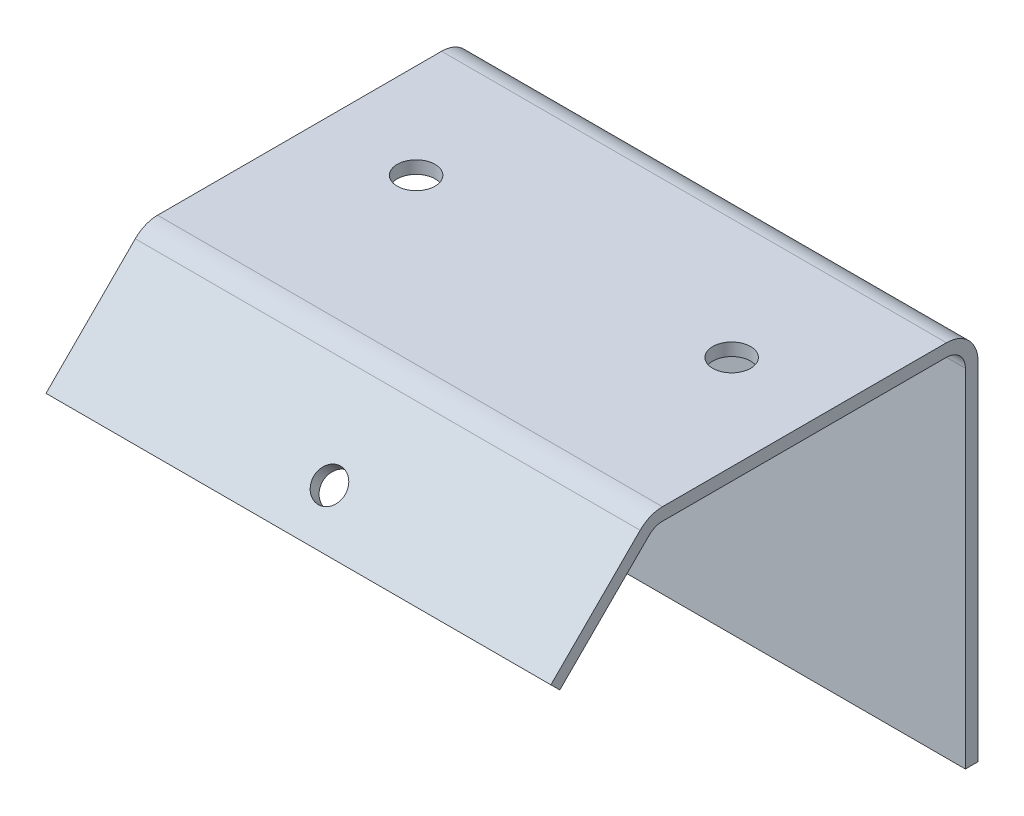
ISO-10303-21;
HEADER;
FILE_DESCRIPTION(('STEP AP214'),'2;1');
FILE_NAME('part.step','',(''),(''),'','','');
FILE_SCHEMA(('AUTOMOTIVE_DESIGN { 1 0 10303 214 1 1 1 1 }'));
ENDSEC;
DATA;
#1=APPLICATION_CONTEXT('core data for automotive mechanical design processes');
#2=APPLICATION_PROTOCOL_DEFINITION('international standard','automotive_design',2000,#1);
#3=PRODUCT_CONTEXT('',#1,'mechanical');
#4=PRODUCT('Part','Part','',(#3));
#5=PRODUCT_RELATED_PRODUCT_CATEGORY('part','',(#4));
#6=PRODUCT_DEFINITION_FORMATION('','',#4);
#7=PRODUCT_DEFINITION_CONTEXT('part definition',#1,'design');
#8=PRODUCT_DEFINITION('design','',#6,#7);
#9=PRODUCT_DEFINITION_SHAPE('','',#8);
#10=(LENGTH_UNIT() NAMED_UNIT(*) SI_UNIT(.MILLI.,.METRE.));
#11=(NAMED_UNIT(*) PLANE_ANGLE_UNIT() SI_UNIT($,.RADIAN.));
#12=(NAMED_UNIT(*) SI_UNIT($,.STERADIAN.) SOLID_ANGLE_UNIT());
#13=UNCERTAINTY_MEASURE_WITH_UNIT(LENGTH_MEASURE(1.E-05),#10,'distance_accuracy_value','');
#14=(GEOMETRIC_REPRESENTATION_CONTEXT(3) GLOBAL_UNCERTAINTY_ASSIGNED_CONTEXT((#13)) GLOBAL_UNIT_ASSIGNED_CONTEXT((#10,
#11,#12)) REPRESENTATION_CONTEXT('',''));
#15=CARTESIAN_POINT('',(0.,0.,0.));
#16=DIRECTION('',(0.,0.,1.));
#17=DIRECTION('',(1.,0.,0.));
#18=AXIS2_PLACEMENT_3D('',#15,#16,#17);
#19=CARTESIAN_POINT('',(40.,0.,2.));
#20=DIRECTION('',(0.,1.,0.));
#21=DIRECTION('',(0.,0.,1.));
#22=AXIS2_PLACEMENT_3D('',#19,#20,#21);
#23=PLANE('',#22);
#24=DIRECTION('',(0.,0.,-1.));
#25=VECTOR('',#24,1.);
#26=CARTESIAN_POINT('',(-40.,0.,2.));
#27=LINE('',#26,#25);
#28=CARTESIAN_POINT('',(-40.,0.,2.));
#29=VERTEX_POINT('',#28);
#30=CARTESIAN_POINT('',(-40.,0.,0.));
#31=VERTEX_POINT('',#30);
#32=EDGE_CURVE('E199',#29,#31,#27,.T.);
#33=ORIENTED_EDGE('',*,*,#32,.T.);
#34=DIRECTION('',(-1.,0.,0.));
#35=VECTOR('',#34,1.);
#36=CARTESIAN_POINT('',(40.,0.,0.));
#37=LINE('',#36,#35);
#38=CARTESIAN_POINT('',(40.,0.,0.));
#39=VERTEX_POINT('',#38);
#40=EDGE_CURVE('E12',#39,#31,#37,.T.);
#41=ORIENTED_EDGE('',*,*,#40,.F.);
#42=DIRECTION('',(0.,0.,-1.));
#43=VECTOR('',#42,1.);
#44=CARTESIAN_POINT('',(40.,0.,2.));
#45=LINE('',#44,#43);
#46=CARTESIAN_POINT('',(40.,0.,2.));
#47=VERTEX_POINT('',#46);
#48=EDGE_CURVE('E233',#47,#39,#45,.T.);
#49=ORIENTED_EDGE('',*,*,#48,.F.);
#50=DIRECTION('',(-1.,0.,0.));
#51=VECTOR('',#50,1.);
#52=CARTESIAN_POINT('',(40.,0.,2.));
#53=LINE('',#52,#51);
#54=EDGE_CURVE('E195',#47,#29,#53,.T.);
#55=ORIENTED_EDGE('',*,*,#54,.T.);
#56=EDGE_LOOP('',(#33,#41,#49,#55));
#57=FACE_BOUND('',#56,.T.);
#58=ADVANCED_FACE('F69',(#57),#23,.F.);
#59=CARTESIAN_POINT('',(40.,0.,0.));
#60=DIRECTION('',(0.,0.,1.));
#61=DIRECTION('',(1.,0.,0.));
#62=AXIS2_PLACEMENT_3D('',#59,#60,#61);
#63=PLANE('',#62);
#64=CARTESIAN_POINT('',(0.,25.,0.));
#65=DIRECTION('',(0.,0.,1.));
#66=DIRECTION('',(1.,0.,0.));
#67=AXIS2_PLACEMENT_3D('',#64,#65,#66);
#68=CIRCLE('',#67,4.);
#69=CARTESIAN_POINT('',(4.,25.,0.));
#70=VERTEX_POINT('',#69);
#71=EDGE_CURVE('E269',#70,#70,#68,.T.);
#72=ORIENTED_EDGE('',*,*,#71,.T.);
#73=EDGE_LOOP('',(#72));
#74=FACE_BOUND('',#73,.T.);
#75=DIRECTION('',(0.,1.,0.));
#76=VECTOR('',#75,1.);
#77=CARTESIAN_POINT('',(-40.,0.,0.));
#78=LINE('',#77,#76);
#79=CARTESIAN_POINT('',(-40.,55.,0.));
#80=VERTEX_POINT('',#79);
#81=EDGE_CURVE('E203',#31,#80,#78,.T.);
#82=ORIENTED_EDGE('',*,*,#81,.T.);
#83=DIRECTION('',(-1.,0.,0.));
#84=VECTOR('',#83,1.);
#85=CARTESIAN_POINT('',(40.,55.,0.));
#86=LINE('',#85,#84);
#87=CARTESIAN_POINT('',(40.,55.,0.));
#88=VERTEX_POINT('',#87);
#89=EDGE_CURVE('E80',#88,#80,#86,.T.);
#90=ORIENTED_EDGE('',*,*,#89,.F.);
#91=DIRECTION('',(0.,1.,0.));
#92=VECTOR('',#91,1.);
#93=CARTESIAN_POINT('',(40.,0.,0.));
#94=LINE('',#93,#92);
#95=EDGE_CURVE('E144',#39,#88,#94,.T.);
#96=ORIENTED_EDGE('',*,*,#95,.F.);
#97=ORIENTED_EDGE('',*,*,#40,.T.);
#98=EDGE_LOOP('',(#82,#90,#96,#97));
#99=FACE_BOUND('',#98,.T.);
#100=ADVANCED_FACE('F350',(#74,#99),#63,.F.);
#101=CARTESIAN_POINT('',(40.,54.9998842346693,5.00011576533067));
#102=DIRECTION('',(-1.,0.,0.));
#103=DIRECTION('',(0.,0.,1.));
#104=AXIS2_PLACEMENT_3D('',#101,#102,#103);
#105=CYLINDRICAL_SURFACE('',#104,5.0001157666708);
#106=CARTESIAN_POINT('',(-40.,54.9998842346693,5.00011576533067));
#107=DIRECTION('',(1.,0.,0.));
#108=DIRECTION('',(0.,0.,-1.));
#109=AXIS2_PLACEMENT_3D('',#106,#107,#108);
#110=CIRCLE('',#109,5.0001157666708);
#111=CARTESIAN_POINT('',(-40.,60.,5.));
#112=VERTEX_POINT('',#111);
#113=EDGE_CURVE('E207',#80,#112,#110,.T.);
#114=ORIENTED_EDGE('',*,*,#113,.T.);
#115=DIRECTION('',(-1.,0.,0.));
#116=VECTOR('',#115,1.);
#117=CARTESIAN_POINT('',(40.,60.,5.));
#118=LINE('',#117,#116);
#119=CARTESIAN_POINT('',(40.,60.,5.));
#120=VERTEX_POINT('',#119);
#121=EDGE_CURVE('E259',#120,#112,#118,.T.);
#122=ORIENTED_EDGE('',*,*,#121,.F.);
#123=CARTESIAN_POINT('',(40.,54.9998842346693,5.00011576533067));
#124=DIRECTION('',(1.,0.,0.));
#125=DIRECTION('',(0.,0.,-1.));
#126=AXIS2_PLACEMENT_3D('',#123,#124,#125);
#127=CIRCLE('',#126,5.0001157666708);
#128=EDGE_CURVE('E304',#88,#120,#127,.T.);
#129=ORIENTED_EDGE('',*,*,#128,.F.);
#130=ORIENTED_EDGE('',*,*,#89,.T.);
#131=EDGE_LOOP('',(#114,#122,#129,#130));
#132=FACE_BOUND('',#131,.T.);
#133=ADVANCED_FACE('F353',(#132),#105,.T.);
#134=CARTESIAN_POINT('',(40.,60.,5.));
#135=DIRECTION('',(0.,-1.,0.));
#136=DIRECTION('',(0.,0.,-1.));
#137=AXIS2_PLACEMENT_3D('',#134,#135,#136);
#138=PLANE('',#137);
#139=CARTESIAN_POINT('',(25.,60.,24.031));
#140=DIRECTION('',(0.,-1.,0.));
#141=DIRECTION('',(0.,0.,-1.));
#142=AXIS2_PLACEMENT_3D('',#139,#140,#141);
#143=CIRCLE('',#142,3.);
#144=CARTESIAN_POINT('',(25.,60.,21.031));
#145=VERTEX_POINT('',#144);
#146=EDGE_CURVE('E274',#145,#145,#143,.T.);
#147=ORIENTED_EDGE('',*,*,#146,.T.);
#148=EDGE_LOOP('',(#147));
#149=FACE_BOUND('',#148,.T.);
#150=CARTESIAN_POINT('',(-25.,60.,24.031));
#151=DIRECTION('',(0.,-1.,0.));
#152=DIRECTION('',(0.,0.,-1.));
#153=AXIS2_PLACEMENT_3D('',#150,#151,#152);
#154=CIRCLE('',#153,3.);
#155=CARTESIAN_POINT('',(-25.,60.,21.031));
#156=VERTEX_POINT('',#155);
#157=EDGE_CURVE('E273',#156,#156,#154,.T.);
#158=ORIENTED_EDGE('',*,*,#157,.T.);
#159=EDGE_LOOP('',(#158));
#160=FACE_BOUND('',#159,.T.);
#161=DIRECTION('',(0.,0.,1.));
#162=VECTOR('',#161,1.);
#163=CARTESIAN_POINT('',(-40.,60.,5.));
#164=LINE('',#163,#162);
#165=CARTESIAN_POINT('',(-40.,60.,50.));
#166=VERTEX_POINT('',#165);
#167=EDGE_CURVE('E210',#112,#166,#164,.T.);
#168=ORIENTED_EDGE('',*,*,#167,.T.);
#169=DIRECTION('',(-1.,0.,0.));
#170=VECTOR('',#169,1.);
#171=CARTESIAN_POINT('',(40.,60.,50.));
#172=LINE('',#171,#170);
#173=CARTESIAN_POINT('',(40.,60.,50.));
#174=VERTEX_POINT('',#173);
#175=EDGE_CURVE('E255',#174,#166,#172,.T.);
#176=ORIENTED_EDGE('',*,*,#175,.F.);
#177=DIRECTION('',(0.,0.,1.));
#178=VECTOR('',#177,1.);
#179=CARTESIAN_POINT('',(40.,60.,5.));
#180=LINE('',#179,#178);
#181=EDGE_CURVE('E306',#120,#174,#180,.T.);
#182=ORIENTED_EDGE('',*,*,#181,.F.);
#183=ORIENTED_EDGE('',*,*,#121,.T.);
#184=EDGE_LOOP('',(#168,#176,#182,#183));
#185=FACE_BOUND('',#184,.T.);
#186=ADVANCED_FACE('F357',(#149,#160,#185),#138,.F.);
#187=CARTESIAN_POINT('',(40.,55.0002614478282,50.0000404865915));
#188=DIRECTION('',(-1.,0.,0.));
#189=DIRECTION('',(0.,0.,1.));
#190=AXIS2_PLACEMENT_3D('',#187,#188,#189);
#191=CYLINDRICAL_SURFACE('',#190,4.99973855233572);
#192=CARTESIAN_POINT('',(-40.,55.0002614478282,50.0000404865915));
#193=DIRECTION('',(1.,0.,0.));
#194=DIRECTION('',(0.,0.,-1.));
#195=AXIS2_PLACEMENT_3D('',#192,#193,#194);
#196=CIRCLE('',#195,4.99973855233572);
#197=CARTESIAN_POINT('',(-40.,58.5355,53.5355));
#198=VERTEX_POINT('',#197);
#199=EDGE_CURVE('E213',#166,#198,#196,.T.);
#200=ORIENTED_EDGE('',*,*,#199,.T.);
#201=DIRECTION('',(-1.,0.,0.));
#202=VECTOR('',#201,1.);
#203=CARTESIAN_POINT('',(40.,58.5355,53.5355));
#204=LINE('',#203,#202);
#205=CARTESIAN_POINT('',(40.,58.5355,53.5355));
#206=VERTEX_POINT('',#205);
#207=EDGE_CURVE('E251',#206,#198,#204,.T.);
#208=ORIENTED_EDGE('',*,*,#207,.F.);
#209=CARTESIAN_POINT('',(40.,55.0002614478282,50.0000404865915));
#210=DIRECTION('',(1.,0.,0.));
#211=DIRECTION('',(0.,0.,-1.));
#212=AXIS2_PLACEMENT_3D('',#209,#210,#211);
#213=CIRCLE('',#212,4.99973855233572);
#214=EDGE_CURVE('E309',#174,#206,#213,.T.);
#215=ORIENTED_EDGE('',*,*,#214,.F.);
#216=ORIENTED_EDGE('',*,*,#175,.T.);
#217=EDGE_LOOP('',(#200,#208,#215,#216));
#218=FACE_BOUND('',#217,.T.);
#219=ADVANCED_FACE('F367',(#218),#191,.T.);
#220=CARTESIAN_POINT('',(40.,58.5355,53.5355));
#221=DIRECTION('',(0.,-0.707109281179587,-0.707104281184669));
#222=DIRECTION('',(0.,0.707104281184669,-0.707109281179587));
#223=AXIS2_PLACEMENT_3D('',#220,#221,#222);
#224=PLANE('',#223);
#225=CARTESIAN_POINT('',(0.,49.3105326152671,62.7605326152671));
#226=DIRECTION('',(0.,-0.707109281179587,-0.707104281184669));
#227=DIRECTION('',(0.,0.707104281184669,-0.707109281179587));
#228=AXIS2_PLACEMENT_3D('',#225,#226,#227);
#229=CIRCLE('',#228,2.5);
#230=CARTESIAN_POINT('',(0.,51.0782933182288,60.9927594123182));
#231=VERTEX_POINT('',#230);
#232=EDGE_CURVE('E278',#231,#231,#229,.T.);
#233=ORIENTED_EDGE('',*,*,#232,.T.);
#234=EDGE_LOOP('',(#233));
#235=FACE_BOUND('',#234,.T.);
#236=DIRECTION('',(0.,-0.707104281184669,0.707109281179587));
#237=VECTOR('',#236,1.);
#238=CARTESIAN_POINT('',(-40.,58.5355,53.5355));
#239=LINE('',#238,#237);
#240=CARTESIAN_POINT('',(-40.,44.3934,67.6777));
#241=VERTEX_POINT('',#240);
#242=EDGE_CURVE('E216',#198,#241,#239,.T.);
#243=ORIENTED_EDGE('',*,*,#242,.T.);
#244=DIRECTION('',(-1.,0.,0.));
#245=VECTOR('',#244,1.);
#246=CARTESIAN_POINT('',(40.,44.3934,67.6777));
#247=LINE('',#246,#245);
#248=CARTESIAN_POINT('',(40.,44.3934,67.6777));
#249=VERTEX_POINT('',#248);
#250=EDGE_CURVE('E247',#249,#241,#247,.T.);
#251=ORIENTED_EDGE('',*,*,#250,.F.);
#252=DIRECTION('',(0.,-0.707104281184669,0.707109281179587));
#253=VECTOR('',#252,1.);
#254=CARTESIAN_POINT('',(40.,58.5355,53.5355));
#255=LINE('',#254,#253);
#256=EDGE_CURVE('E312',#206,#249,#255,.T.);
#257=ORIENTED_EDGE('',*,*,#256,.F.);
#258=ORIENTED_EDGE('',*,*,#207,.T.);
#259=EDGE_LOOP('',(#243,#251,#257,#258));
#260=FACE_BOUND('',#259,.T.);
#261=ADVANCED_FACE('F372',(#235,#260),#224,.F.);
#262=CARTESIAN_POINT('',(40.,44.3934,67.6777));
#263=DIRECTION('',(0.,0.7071317801005,-0.707081781388757));
#264=DIRECTION('',(0.,0.707081781388758,0.7071317801005));
#265=AXIS2_PLACEMENT_3D('',#262,#263,#264);
#266=PLANE('',#265);
#267=DIRECTION('',(0.,-0.707081781388757,-0.7071317801005));
#268=VECTOR('',#267,1.);
#269=CARTESIAN_POINT('',(-40.,44.3934,67.6777));
#270=LINE('',#269,#268);
#271=CARTESIAN_POINT('',(-40.,42.9792,66.2634));
#272=VERTEX_POINT('',#271);
#273=EDGE_CURVE('E219',#241,#272,#270,.T.);
#274=ORIENTED_EDGE('',*,*,#273,.T.);
#275=DIRECTION('',(-1.,0.,0.));
#276=VECTOR('',#275,1.);
#277=CARTESIAN_POINT('',(40.,42.9792,66.2634));
#278=LINE('',#277,#276);
#279=CARTESIAN_POINT('',(40.,42.9792,66.2634));
#280=VERTEX_POINT('',#279);
#281=EDGE_CURVE('E244',#280,#272,#278,.T.);
#282=ORIENTED_EDGE('',*,*,#281,.F.);
#283=DIRECTION('',(0.,-0.707081781388757,-0.7071317801005));
#284=VECTOR('',#283,1.);
#285=CARTESIAN_POINT('',(40.,44.3934,67.6777));
#286=LINE('',#285,#284);
#287=EDGE_CURVE('E315',#249,#280,#286,.T.);
#288=ORIENTED_EDGE('',*,*,#287,.F.);
#289=ORIENTED_EDGE('',*,*,#250,.T.);
#290=EDGE_LOOP('',(#274,#282,#288,#289));
#291=FACE_BOUND('',#290,.T.);
#292=ADVANCED_FACE('F377',(#291),#266,.F.);
#293=CARTESIAN_POINT('',(40.,42.9792,66.2634));
#294=DIRECTION('',(0.,0.707106781186548,0.707106781186547));
#295=DIRECTION('',(0.,-0.707106781186547,0.707106781186548));
#296=AXIS2_PLACEMENT_3D('',#293,#294,#295);
#297=PLANE('',#296);
#298=CARTESIAN_POINT('',(0.,47.8963,61.3463));
#299=DIRECTION('',(0.,0.707106781186548,0.707106781186547));
#300=DIRECTION('',(0.,-0.707106781186547,0.707106781186548));
#301=AXIS2_PLACEMENT_3D('',#298,#299,#300);
#302=CIRCLE('',#301,2.5);
#303=CARTESIAN_POINT('',(0.,46.1285330470336,63.1140669529664));
#304=VERTEX_POINT('',#303);
#305=EDGE_CURVE('E73',#304,#304,#302,.T.);
#306=ORIENTED_EDGE('',*,*,#305,.T.);
#307=EDGE_LOOP('',(#306));
#308=FACE_BOUND('',#307,.T.);
#309=DIRECTION('',(0.,0.707106781186547,-0.707106781186548));
#310=VECTOR('',#309,1.);
#311=CARTESIAN_POINT('',(-40.,42.9792,66.2634));
#312=LINE('',#311,#310);
#313=CARTESIAN_POINT('',(-40.,57.1213,52.1213));
#314=VERTEX_POINT('',#313);
#315=EDGE_CURVE('E222',#272,#314,#312,.T.);
#316=ORIENTED_EDGE('',*,*,#315,.T.);
#317=DIRECTION('',(-1.,0.,0.));
#318=VECTOR('',#317,1.);
#319=CARTESIAN_POINT('',(40.,57.1213,52.1213));
#320=LINE('',#319,#318);
#321=CARTESIAN_POINT('',(40.,57.1213,52.1213));
#322=VERTEX_POINT('',#321);
#323=EDGE_CURVE('E240',#322,#314,#320,.T.);
#324=ORIENTED_EDGE('',*,*,#323,.F.);
#325=DIRECTION('',(0.,0.707106781186547,-0.707106781186548));
#326=VECTOR('',#325,1.);
#327=CARTESIAN_POINT('',(40.,42.9792,66.2634));
#328=LINE('',#327,#326);
#329=EDGE_CURVE('E318',#280,#322,#328,.T.);
#330=ORIENTED_EDGE('',*,*,#329,.F.);
#331=ORIENTED_EDGE('',*,*,#281,.T.);
#332=EDGE_LOOP('',(#316,#324,#330,#331));
#333=FACE_BOUND('',#332,.T.);
#334=ADVANCED_FACE('F325',(#308,#333),#297,.F.);
#335=CARTESIAN_POINT('',(40.,54.9999870459957,49.9999539467857));
#336=DIRECTION('',(-1.,0.,0.));
#337=DIRECTION('',(0.,0.,1.));
#338=AXIS2_PLACEMENT_3D('',#335,#336,#337);
#339=CYLINDRICAL_SURFACE('',#338,3.00001295435775);
#340=CARTESIAN_POINT('',(-40.,54.9999870459957,49.9999539467857));
#341=DIRECTION('',(-1.,0.,0.));
#342=DIRECTION('',(0.,0.,1.));
#343=AXIS2_PLACEMENT_3D('',#340,#341,#342);
#344=CIRCLE('',#343,3.00001295435775);
#345=CARTESIAN_POINT('',(-40.,58.,50.));
#346=VERTEX_POINT('',#345);
#347=EDGE_CURVE('E225',#314,#346,#344,.T.);
#348=ORIENTED_EDGE('',*,*,#347,.T.);
#349=DIRECTION('',(-1.,0.,0.));
#350=VECTOR('',#349,1.);
#351=CARTESIAN_POINT('',(40.,58.,50.));
#352=LINE('',#351,#350);
#353=CARTESIAN_POINT('',(40.,58.,50.));
#354=VERTEX_POINT('',#353);
#355=EDGE_CURVE('E186',#354,#346,#352,.T.);
#356=ORIENTED_EDGE('',*,*,#355,.F.);
#357=CARTESIAN_POINT('',(40.,54.9999870459957,49.9999539467857));
#358=DIRECTION('',(-1.,0.,0.));
#359=DIRECTION('',(0.,0.,1.));
#360=AXIS2_PLACEMENT_3D('',#357,#358,#359);
#361=CIRCLE('',#360,3.00001295435775);
#362=EDGE_CURVE('E175',#322,#354,#361,.T.);
#363=ORIENTED_EDGE('',*,*,#362,.F.);
#364=ORIENTED_EDGE('',*,*,#323,.T.);
#365=EDGE_LOOP('',(#348,#356,#363,#364));
#366=FACE_BOUND('',#365,.T.);
#367=ADVANCED_FACE('F329',(#366),#339,.F.);
#368=CARTESIAN_POINT('',(40.,58.,50.));
#369=DIRECTION('',(0.,1.,0.));
#370=DIRECTION('',(0.,0.,1.));
#371=AXIS2_PLACEMENT_3D('',#368,#369,#370);
#372=PLANE('',#371);
#373=CARTESIAN_POINT('',(25.,58.,24.031));
#374=DIRECTION('',(0.,1.,0.));
#375=DIRECTION('',(0.,0.,1.));
#376=AXIS2_PLACEMENT_3D('',#373,#374,#375);
#377=CIRCLE('',#376,3.);
#378=CARTESIAN_POINT('',(25.,58.,27.031));
#379=VERTEX_POINT('',#378);
#380=EDGE_CURVE('E275',#379,#379,#377,.T.);
#381=ORIENTED_EDGE('',*,*,#380,.T.);
#382=EDGE_LOOP('',(#381));
#383=FACE_BOUND('',#382,.T.);
#384=CARTESIAN_POINT('',(-25.,58.,24.031));
#385=DIRECTION('',(0.,1.,0.));
#386=DIRECTION('',(0.,0.,1.));
#387=AXIS2_PLACEMENT_3D('',#384,#385,#386);
#388=CIRCLE('',#387,3.);
#389=CARTESIAN_POINT('',(-25.,58.,27.031));
#390=VERTEX_POINT('',#389);
#391=EDGE_CURVE('E270',#390,#390,#388,.T.);
#392=ORIENTED_EDGE('',*,*,#391,.T.);
#393=EDGE_LOOP('',(#392));
#394=FACE_BOUND('',#393,.T.);
#395=DIRECTION('',(0.,0.,-1.));
#396=VECTOR('',#395,1.);
#397=CARTESIAN_POINT('',(-40.,58.,50.));
#398=LINE('',#397,#396);
#399=CARTESIAN_POINT('',(-40.,58.,5.));
#400=VERTEX_POINT('',#399);
#401=EDGE_CURVE('E184',#346,#400,#398,.T.);
#402=ORIENTED_EDGE('',*,*,#401,.T.);
#403=DIRECTION('',(-1.,0.,0.));
#404=VECTOR('',#403,1.);
#405=CARTESIAN_POINT('',(40.,58.,5.));
#406=LINE('',#405,#404);
#407=CARTESIAN_POINT('',(40.,58.,5.));
#408=VERTEX_POINT('',#407);
#409=EDGE_CURVE('E181',#408,#400,#406,.T.);
#410=ORIENTED_EDGE('',*,*,#409,.F.);
#411=DIRECTION('',(0.,0.,-1.));
#412=VECTOR('',#411,1.);
#413=CARTESIAN_POINT('',(40.,58.,50.));
#414=LINE('',#413,#412);
#415=EDGE_CURVE('E169',#354,#408,#414,.T.);
#416=ORIENTED_EDGE('',*,*,#415,.F.);
#417=ORIENTED_EDGE('',*,*,#355,.T.);
#418=EDGE_LOOP('',(#402,#410,#416,#417));
#419=FACE_BOUND('',#418,.T.);
#420=ADVANCED_FACE('F182',(#383,#394,#419),#372,.F.);
#421=CARTESIAN_POINT('',(40.,54.9999305408016,5.00006945919844));
#422=DIRECTION('',(-1.,0.,0.));
#423=DIRECTION('',(0.,0.,1.));
#424=AXIS2_PLACEMENT_3D('',#421,#422,#423);
#425=CYLINDRICAL_SURFACE('',#424,3.00006946000252);
#426=CARTESIAN_POINT('',(-40.,54.9999305408016,5.00006945919844));
#427=DIRECTION('',(-1.,0.,0.));
#428=DIRECTION('',(0.,0.,1.));
#429=AXIS2_PLACEMENT_3D('',#426,#427,#428);
#430=CIRCLE('',#429,3.00006946000252);
#431=CARTESIAN_POINT('',(-40.,55.,2.));
#432=VERTEX_POINT('',#431);
#433=EDGE_CURVE('E130',#400,#432,#430,.T.);
#434=ORIENTED_EDGE('',*,*,#433,.T.);
#435=DIRECTION('',(-1.,0.,0.));
#436=VECTOR('',#435,1.);
#437=CARTESIAN_POINT('',(40.,55.,2.));
#438=LINE('',#437,#436);
#439=CARTESIAN_POINT('',(40.,55.,2.));
#440=VERTEX_POINT('',#439);
#441=EDGE_CURVE('E187',#440,#432,#438,.T.);
#442=ORIENTED_EDGE('',*,*,#441,.F.);
#443=CARTESIAN_POINT('',(40.,54.9999305408016,5.00006945919844));
#444=DIRECTION('',(-1.,0.,0.));
#445=DIRECTION('',(0.,0.,1.));
#446=AXIS2_PLACEMENT_3D('',#443,#444,#445);
#447=CIRCLE('',#446,3.00006946000252);
#448=EDGE_CURVE('E173',#408,#440,#447,.T.);
#449=ORIENTED_EDGE('',*,*,#448,.F.);
#450=ORIENTED_EDGE('',*,*,#409,.T.);
#451=EDGE_LOOP('',(#434,#442,#449,#450));
#452=FACE_BOUND('',#451,.T.);
#453=ADVANCED_FACE('F189',(#452),#425,.F.);
#454=CARTESIAN_POINT('',(40.,55.,2.));
#455=DIRECTION('',(0.,0.,-1.));
#456=DIRECTION('',(-1.,0.,0.));
#457=AXIS2_PLACEMENT_3D('',#454,#455,#456);
#458=PLANE('',#457);
#459=CARTESIAN_POINT('',(0.,25.,2.));
#460=DIRECTION('',(0.,0.,-1.));
#461=DIRECTION('',(-1.,0.,0.));
#462=AXIS2_PLACEMENT_3D('',#459,#460,#461);
#463=CIRCLE('',#462,4.);
#464=CARTESIAN_POINT('',(-4.,25.,2.));
#465=VERTEX_POINT('',#464);
#466=EDGE_CURVE('E204',#465,#465,#463,.F.);
#467=ORIENTED_EDGE('',*,*,#466,.F.);
#468=EDGE_LOOP('',(#467));
#469=FACE_BOUND('',#468,.T.);
#470=DIRECTION('',(0.,-1.,0.));
#471=VECTOR('',#470,1.);
#472=CARTESIAN_POINT('',(-40.,55.,2.));
#473=LINE('',#472,#471);
#474=EDGE_CURVE('E136',#432,#29,#473,.T.);
#475=ORIENTED_EDGE('',*,*,#474,.T.);
#476=ORIENTED_EDGE('',*,*,#54,.F.);
#477=DIRECTION('',(0.,-1.,0.));
#478=VECTOR('',#477,1.);
#479=CARTESIAN_POINT('',(40.,55.,2.));
#480=LINE('',#479,#478);
#481=EDGE_CURVE('E89',#440,#47,#480,.T.);
#482=ORIENTED_EDGE('',*,*,#481,.F.);
#483=ORIENTED_EDGE('',*,*,#441,.T.);
#484=EDGE_LOOP('',(#475,#476,#482,#483));
#485=FACE_BOUND('',#484,.T.);
#486=ADVANCED_FACE('F337',(#469,#485),#458,.F.);
#487=CARTESIAN_POINT('',(40.,54.9998842346693,5.00011576533067));
#488=DIRECTION('',(1.,0.,0.));
#489=DIRECTION('',(0.,0.,-1.));
#490=AXIS2_PLACEMENT_3D('',#487,#488,#489);
#491=PLANE('',#490);
#492=ORIENTED_EDGE('',*,*,#48,.T.);
#493=ORIENTED_EDGE('',*,*,#95,.T.);
#494=ORIENTED_EDGE('',*,*,#128,.T.);
#495=ORIENTED_EDGE('',*,*,#181,.T.);
#496=ORIENTED_EDGE('',*,*,#214,.T.);
#497=ORIENTED_EDGE('',*,*,#256,.T.);
#498=ORIENTED_EDGE('',*,*,#287,.T.);
#499=ORIENTED_EDGE('',*,*,#329,.T.);
#500=ORIENTED_EDGE('',*,*,#362,.T.);
#501=ORIENTED_EDGE('',*,*,#415,.T.);
#502=ORIENTED_EDGE('',*,*,#448,.T.);
#503=ORIENTED_EDGE('',*,*,#481,.T.);
#504=EDGE_LOOP('',(#492,#493,#494,#495,#496,#497,#498,#499,#500,#501,#502,#503));
#505=FACE_BOUND('',#504,.T.);
#506=ADVANCED_FACE('F171',(#505),#491,.T.);
#507=CARTESIAN_POINT('',(-40.,54.9998842346693,5.00011576533067));
#508=DIRECTION('',(1.,0.,0.));
#509=DIRECTION('',(0.,0.,-1.));
#510=AXIS2_PLACEMENT_3D('',#507,#508,#509);
#511=PLANE('',#510);
#512=ORIENTED_EDGE('',*,*,#32,.F.);
#513=ORIENTED_EDGE('',*,*,#474,.F.);
#514=ORIENTED_EDGE('',*,*,#433,.F.);
#515=ORIENTED_EDGE('',*,*,#401,.F.);
#516=ORIENTED_EDGE('',*,*,#347,.F.);
#517=ORIENTED_EDGE('',*,*,#315,.F.);
#518=ORIENTED_EDGE('',*,*,#273,.F.);
#519=ORIENTED_EDGE('',*,*,#242,.F.);
#520=ORIENTED_EDGE('',*,*,#199,.F.);
#521=ORIENTED_EDGE('',*,*,#167,.F.);
#522=ORIENTED_EDGE('',*,*,#113,.F.);
#523=ORIENTED_EDGE('',*,*,#81,.F.);
#524=EDGE_LOOP('',(#512,#513,#514,#515,#516,#517,#518,#519,#520,#521,#522,#523));
#525=FACE_BOUND('',#524,.T.);
#526=ADVANCED_FACE('F332',(#525),#511,.F.);
#527=CARTESIAN_POINT('',(0.,25.,67.6777));
#528=DIRECTION('',(0.,0.,-1.));
#529=DIRECTION('',(-1.,0.,0.));
#530=AXIS2_PLACEMENT_3D('',#527,#528,#529);
#531=CYLINDRICAL_SURFACE('',#530,4.);
#532=ORIENTED_EDGE('',*,*,#71,.F.);
#533=EDGE_LOOP('',(#532));
#534=FACE_BOUND('',#533,.T.);
#535=ORIENTED_EDGE('',*,*,#466,.T.);
#536=EDGE_LOOP('',(#535));
#537=FACE_BOUND('',#536,.T.);
#538=ADVANCED_FACE('F396',(#534,#537),#531,.F.);
#539=CARTESIAN_POINT('',(-25.,53.8,24.031));
#540=DIRECTION('',(0.,1.,0.));
#541=DIRECTION('',(0.,0.,1.));
#542=AXIS2_PLACEMENT_3D('',#539,#540,#541);
#543=CYLINDRICAL_SURFACE('',#542,3.);
#544=ORIENTED_EDGE('',*,*,#391,.F.);
#545=EDGE_LOOP('',(#544));
#546=FACE_BOUND('',#545,.T.);
#547=ORIENTED_EDGE('',*,*,#157,.F.);
#548=EDGE_LOOP('',(#547));
#549=FACE_BOUND('',#548,.T.);
#550=ADVANCED_FACE('F399',(#546,#549),#543,.F.);
#551=CARTESIAN_POINT('',(25.,53.8,24.031));
#552=DIRECTION('',(0.,1.,0.));
#553=DIRECTION('',(0.,0.,1.));
#554=AXIS2_PLACEMENT_3D('',#551,#552,#553);
#555=CYLINDRICAL_SURFACE('',#554,3.);
#556=ORIENTED_EDGE('',*,*,#380,.F.);
#557=EDGE_LOOP('',(#556));
#558=FACE_BOUND('',#557,.T.);
#559=ORIENTED_EDGE('',*,*,#146,.F.);
#560=EDGE_LOOP('',(#559));
#561=FACE_BOUND('',#560,.T.);
#562=ADVANCED_FACE('F402',(#558,#561),#555,.F.);
#563=CARTESIAN_POINT('',(0.,44.926466,58.376466));
#564=DIRECTION('',(0.,0.707106781186548,0.707106781186547));
#565=DIRECTION('',(0.,-0.707106781186547,0.707106781186548));
#566=AXIS2_PLACEMENT_3D('',#563,#564,#565);
#567=CYLINDRICAL_SURFACE('',#566,2.5);
#568=ORIENTED_EDGE('',*,*,#305,.F.);
#569=EDGE_LOOP('',(#568));
#570=FACE_BOUND('',#569,.T.);
#571=ORIENTED_EDGE('',*,*,#232,.F.);
#572=EDGE_LOOP('',(#571));
#573=FACE_BOUND('',#572,.T.);
#574=ADVANCED_FACE('F404',(#570,#573),#567,.F.);
#575=CLOSED_SHELL('',(#58,#100,#133,#186,#219,#261,#292,#334,#367,#420,#453,#486,#506,#526,#538,
#550,#562,#574));
#576=MANIFOLD_SOLID_BREP('B2',#575);
#577=ADVANCED_BREP_SHAPE_REPRESENTATION('',(#18,#576),#14);
#578=SHAPE_DEFINITION_REPRESENTATION(#9,#577);
ENDSEC;
END-ISO-10303-21;
